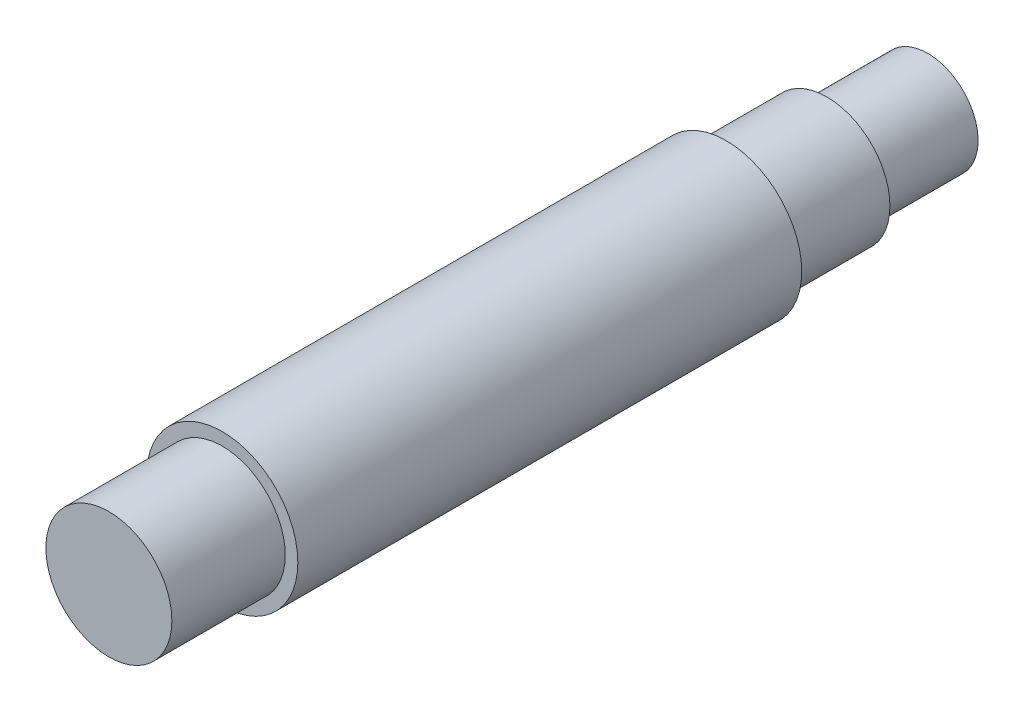
ISO-10303-21;
HEADER;
FILE_DESCRIPTION(('STEP AP214'),'2;1');
FILE_NAME('part.step','',(''),(''),'','','');
FILE_SCHEMA(('AUTOMOTIVE_DESIGN { 1 0 10303 214 1 1 1 1 }'));
ENDSEC;
DATA;
#1=APPLICATION_CONTEXT('core data for automotive mechanical design processes');
#2=APPLICATION_PROTOCOL_DEFINITION('international standard','automotive_design',2000,#1);
#3=PRODUCT_CONTEXT('',#1,'mechanical');
#4=PRODUCT('Part','Part','',(#3));
#5=PRODUCT_RELATED_PRODUCT_CATEGORY('part','',(#4));
#6=PRODUCT_DEFINITION_FORMATION('','',#4);
#7=PRODUCT_DEFINITION_CONTEXT('part definition',#1,'design');
#8=PRODUCT_DEFINITION('design','',#6,#7);
#9=PRODUCT_DEFINITION_SHAPE('','',#8);
#10=(LENGTH_UNIT() NAMED_UNIT(*) SI_UNIT(.MILLI.,.METRE.));
#11=(NAMED_UNIT(*) PLANE_ANGLE_UNIT() SI_UNIT($,.RADIAN.));
#12=(NAMED_UNIT(*) SI_UNIT($,.STERADIAN.) SOLID_ANGLE_UNIT());
#13=UNCERTAINTY_MEASURE_WITH_UNIT(LENGTH_MEASURE(1.E-05),#10,'distance_accuracy_value','');
#14=(GEOMETRIC_REPRESENTATION_CONTEXT(3) GLOBAL_UNCERTAINTY_ASSIGNED_CONTEXT((#13)) GLOBAL_UNIT_ASSIGNED_CONTEXT((#10,
#11,#12)) REPRESENTATION_CONTEXT('',''));
#15=CARTESIAN_POINT('',(0.,0.,0.));
#16=DIRECTION('',(0.,0.,1.));
#17=DIRECTION('',(1.,0.,0.));
#18=AXIS2_PLACEMENT_3D('',#15,#16,#17);
#19=CARTESIAN_POINT('',(0.,0.,-8.));
#20=DIRECTION('',(0.,0.,-1.));
#21=DIRECTION('',(-1.,0.,0.));
#22=AXIS2_PLACEMENT_3D('',#19,#20,#21);
#23=PLANE('',#22);
#24=CARTESIAN_POINT('',(0.,0.,-8.));
#25=DIRECTION('',(0.,0.,-1.));
#26=DIRECTION('',(-1.,0.,0.));
#27=AXIS2_PLACEMENT_3D('',#24,#25,#26);
#28=CIRCLE('',#27,5.);
#29=CARTESIAN_POINT('',(-5.,0.,-8.));
#30=VERTEX_POINT('',#29);
#31=EDGE_CURVE('E52',#30,#30,#28,.T.);
#32=ORIENTED_EDGE('',*,*,#31,.T.);
#33=EDGE_LOOP('',(#32));
#34=FACE_BOUND('',#33,.T.);
#35=CARTESIAN_POINT('',(0.,0.,-8.));
#36=DIRECTION('',(0.,0.,-1.));
#37=DIRECTION('',(-1.,0.,0.));
#38=AXIS2_PLACEMENT_3D('',#35,#36,#37);
#39=CIRCLE('',#38,4.);
#40=CARTESIAN_POINT('',(-4.,0.,-8.));
#41=VERTEX_POINT('',#40);
#42=EDGE_CURVE('E58',#41,#41,#39,.T.);
#43=ORIENTED_EDGE('',*,*,#42,.F.);
#44=EDGE_LOOP('',(#43));
#45=FACE_BOUND('',#44,.T.);
#46=ADVANCED_FACE('F31',(#34,#45),#23,.T.);
#47=CARTESIAN_POINT('',(0.,0.,0.));
#48=DIRECTION('',(0.,0.,1.));
#49=DIRECTION('',(1.,0.,0.));
#50=AXIS2_PLACEMENT_3D('',#47,#48,#49);
#51=PLANE('',#50);
#52=CARTESIAN_POINT('',(0.,0.,0.));
#53=DIRECTION('',(0.,0.,1.));
#54=DIRECTION('',(1.,0.,0.));
#55=AXIS2_PLACEMENT_3D('',#52,#53,#54);
#56=CIRCLE('',#55,6.);
#57=CARTESIAN_POINT('',(6.,0.,0.));
#58=VERTEX_POINT('',#57);
#59=EDGE_CURVE('E42',#58,#58,#56,.T.);
#60=ORIENTED_EDGE('',*,*,#59,.F.);
#61=EDGE_LOOP('',(#60));
#62=FACE_BOUND('',#61,.T.);
#63=CARTESIAN_POINT('',(0.,0.,0.));
#64=DIRECTION('',(0.,0.,1.));
#65=DIRECTION('',(1.,0.,0.));
#66=AXIS2_PLACEMENT_3D('',#63,#64,#65);
#67=CIRCLE('',#66,5.);
#68=CARTESIAN_POINT('',(5.,0.,0.));
#69=VERTEX_POINT('',#68);
#70=EDGE_CURVE('E10',#69,#69,#67,.F.);
#71=ORIENTED_EDGE('',*,*,#70,.F.);
#72=EDGE_LOOP('',(#71));
#73=FACE_BOUND('',#72,.T.);
#74=ADVANCED_FACE('F74',(#62,#73),#51,.F.);
#75=CARTESIAN_POINT('',(0.,0.,40.));
#76=DIRECTION('',(0.,0.,1.));
#77=DIRECTION('',(1.,0.,0.));
#78=AXIS2_PLACEMENT_3D('',#75,#76,#77);
#79=PLANE('',#78);
#80=CARTESIAN_POINT('',(0.,0.,40.));
#81=DIRECTION('',(0.,0.,1.));
#82=DIRECTION('',(1.,0.,0.));
#83=AXIS2_PLACEMENT_3D('',#80,#81,#82);
#84=CIRCLE('',#83,6.);
#85=CARTESIAN_POINT('',(6.,0.,40.));
#86=VERTEX_POINT('',#85);
#87=EDGE_CURVE('E38',#86,#86,#84,.T.);
#88=ORIENTED_EDGE('',*,*,#87,.T.);
#89=EDGE_LOOP('',(#88));
#90=FACE_BOUND('',#89,.T.);
#91=CARTESIAN_POINT('',(0.,0.,40.));
#92=DIRECTION('',(0.,0.,1.));
#93=DIRECTION('',(1.,0.,0.));
#94=AXIS2_PLACEMENT_3D('',#91,#92,#93);
#95=CIRCLE('',#94,5.);
#96=CARTESIAN_POINT('',(5.,0.,40.));
#97=VERTEX_POINT('',#96);
#98=EDGE_CURVE('E49',#97,#97,#95,.T.);
#99=ORIENTED_EDGE('',*,*,#98,.F.);
#100=EDGE_LOOP('',(#99));
#101=FACE_BOUND('',#100,.T.);
#102=ADVANCED_FACE('F80',(#90,#101),#79,.T.);
#103=CARTESIAN_POINT('',(0.,0.,40.));
#104=DIRECTION('',(0.,0.,-1.));
#105=DIRECTION('',(-1.,0.,0.));
#106=AXIS2_PLACEMENT_3D('',#103,#104,#105);
#107=CYLINDRICAL_SURFACE('',#106,6.);
#108=ORIENTED_EDGE('',*,*,#87,.F.);
#109=EDGE_LOOP('',(#108));
#110=FACE_BOUND('',#109,.T.);
#111=ORIENTED_EDGE('',*,*,#59,.T.);
#112=EDGE_LOOP('',(#111));
#113=FACE_BOUND('',#112,.T.);
#114=ADVANCED_FACE('F33',(#110,#113),#107,.T.);
#115=CARTESIAN_POINT('',(0.,0.,49.));
#116=DIRECTION('',(0.,0.,-1.));
#117=DIRECTION('',(-1.,0.,0.));
#118=AXIS2_PLACEMENT_3D('',#115,#116,#117);
#119=CYLINDRICAL_SURFACE('',#118,5.);
#120=CARTESIAN_POINT('',(0.,0.,49.));
#121=DIRECTION('',(0.,0.,1.));
#122=DIRECTION('',(1.,0.,0.));
#123=AXIS2_PLACEMENT_3D('',#120,#121,#122);
#124=CIRCLE('',#123,5.);
#125=CARTESIAN_POINT('',(5.,0.,49.));
#126=VERTEX_POINT('',#125);
#127=EDGE_CURVE('E47',#126,#126,#124,.T.);
#128=ORIENTED_EDGE('',*,*,#127,.F.);
#129=EDGE_LOOP('',(#128));
#130=FACE_BOUND('',#129,.T.);
#131=ORIENTED_EDGE('',*,*,#98,.T.);
#132=EDGE_LOOP('',(#131));
#133=FACE_BOUND('',#132,.T.);
#134=ADVANCED_FACE('F90',(#130,#133),#119,.T.);
#135=CARTESIAN_POINT('',(0.,0.,49.));
#136=DIRECTION('',(0.,0.,1.));
#137=DIRECTION('',(1.,0.,0.));
#138=AXIS2_PLACEMENT_3D('',#135,#136,#137);
#139=PLANE('',#138);
#140=ORIENTED_EDGE('',*,*,#127,.T.);
#141=EDGE_LOOP('',(#140));
#142=FACE_BOUND('',#141,.T.);
#143=ADVANCED_FACE('F86',(#142),#139,.T.);
#144=CARTESIAN_POINT('',(0.,0.,-8.));
#145=DIRECTION('',(0.,0.,1.));
#146=DIRECTION('',(1.,0.,0.));
#147=AXIS2_PLACEMENT_3D('',#144,#145,#146);
#148=CYLINDRICAL_SURFACE('',#147,5.);
#149=ORIENTED_EDGE('',*,*,#31,.F.);
#150=EDGE_LOOP('',(#149));
#151=FACE_BOUND('',#150,.T.);
#152=ORIENTED_EDGE('',*,*,#70,.T.);
#153=EDGE_LOOP('',(#152));
#154=FACE_BOUND('',#153,.T.);
#155=ADVANCED_FACE('F69',(#151,#154),#148,.T.);
#156=CARTESIAN_POINT('',(0.,0.,-16.));
#157=DIRECTION('',(0.,0.,1.));
#158=DIRECTION('',(1.,0.,0.));
#159=AXIS2_PLACEMENT_3D('',#156,#157,#158);
#160=CYLINDRICAL_SURFACE('',#159,4.);
#161=CARTESIAN_POINT('',(0.,0.,-16.));
#162=DIRECTION('',(0.,0.,-1.));
#163=DIRECTION('',(-1.,0.,0.));
#164=AXIS2_PLACEMENT_3D('',#161,#162,#163);
#165=CIRCLE('',#164,4.);
#166=CARTESIAN_POINT('',(-4.,0.,-16.));
#167=VERTEX_POINT('',#166);
#168=EDGE_CURVE('E57',#167,#167,#165,.T.);
#169=ORIENTED_EDGE('',*,*,#168,.F.);
#170=EDGE_LOOP('',(#169));
#171=FACE_BOUND('',#170,.T.);
#172=ORIENTED_EDGE('',*,*,#42,.T.);
#173=EDGE_LOOP('',(#172));
#174=FACE_BOUND('',#173,.T.);
#175=ADVANCED_FACE('F66',(#171,#174),#160,.T.);
#176=CARTESIAN_POINT('',(0.,0.,-16.));
#177=DIRECTION('',(0.,0.,-1.));
#178=DIRECTION('',(-1.,0.,0.));
#179=AXIS2_PLACEMENT_3D('',#176,#177,#178);
#180=PLANE('',#179);
#181=ORIENTED_EDGE('',*,*,#168,.T.);
#182=EDGE_LOOP('',(#181));
#183=FACE_BOUND('',#182,.T.);
#184=ADVANCED_FACE('F64',(#183),#180,.T.);
#185=CLOSED_SHELL('',(#46,#74,#102,#114,#134,#143,#155,#175,#184));
#186=MANIFOLD_SOLID_BREP('B2',#185);
#187=ADVANCED_BREP_SHAPE_REPRESENTATION('',(#18,#186),#14);
#188=SHAPE_DEFINITION_REPRESENTATION(#9,#187);
ENDSEC;
END-ISO-10303-21;
